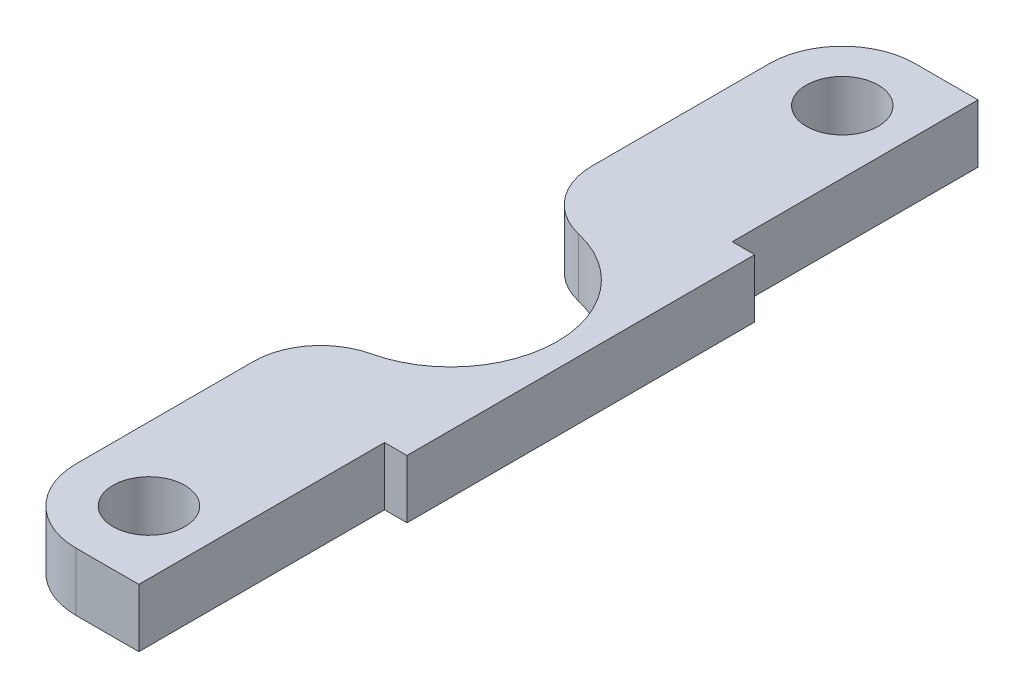
ISO-10303-21;
HEADER;
FILE_DESCRIPTION(('STEP AP214'),'2;1');
FILE_NAME('part.step','',(''),(''),'','','');
FILE_SCHEMA(('AUTOMOTIVE_DESIGN { 1 0 10303 214 1 1 1 1 }'));
ENDSEC;
DATA;
#1=APPLICATION_CONTEXT('core data for automotive mechanical design processes');
#2=APPLICATION_PROTOCOL_DEFINITION('international standard','automotive_design',2000,#1);
#3=PRODUCT_CONTEXT('',#1,'mechanical');
#4=PRODUCT('Part','Part','',(#3));
#5=PRODUCT_RELATED_PRODUCT_CATEGORY('part','',(#4));
#6=PRODUCT_DEFINITION_FORMATION('','',#4);
#7=PRODUCT_DEFINITION_CONTEXT('part definition',#1,'design');
#8=PRODUCT_DEFINITION('design','',#6,#7);
#9=PRODUCT_DEFINITION_SHAPE('','',#8);
#10=(LENGTH_UNIT() NAMED_UNIT(*) SI_UNIT(.MILLI.,.METRE.));
#11=(NAMED_UNIT(*) PLANE_ANGLE_UNIT() SI_UNIT($,.RADIAN.));
#12=(NAMED_UNIT(*) SI_UNIT($,.STERADIAN.) SOLID_ANGLE_UNIT());
#13=UNCERTAINTY_MEASURE_WITH_UNIT(LENGTH_MEASURE(1.E-05),#10,'distance_accuracy_value','');
#14=(GEOMETRIC_REPRESENTATION_CONTEXT(3) GLOBAL_UNCERTAINTY_ASSIGNED_CONTEXT((#13)) GLOBAL_UNIT_ASSIGNED_CONTEXT((#10,
#11,#12)) REPRESENTATION_CONTEXT('',''));
#15=CARTESIAN_POINT('',(0.,0.,0.));
#16=DIRECTION('',(0.,0.,1.));
#17=DIRECTION('',(1.,0.,0.));
#18=AXIS2_PLACEMENT_3D('',#15,#16,#17);
#19=CARTESIAN_POINT('',(-3.25,2.6,-30.9));
#20=DIRECTION('',(1.,0.,0.));
#21=DIRECTION('',(0.,0.,-1.));
#22=AXIS2_PLACEMENT_3D('',#19,#20,#21);
#23=PLANE('',#22);
#24=DIRECTION('',(0.,0.,1.));
#25=VECTOR('',#24,1.);
#26=CARTESIAN_POINT('',(-3.25,2.6,-30.9));
#27=LINE('',#26,#25);
#28=CARTESIAN_POINT('',(-3.25,2.6,-7.90016556472925));
#29=VERTEX_POINT('',#28);
#30=CARTESIAN_POINT('',(-3.25,2.6,0.));
#31=VERTEX_POINT('',#30);
#32=EDGE_CURVE('E186',#29,#31,#27,.T.);
#33=ORIENTED_EDGE('',*,*,#32,.F.);
#34=DIRECTION('',(0.,1.,0.));
#35=VECTOR('',#34,1.);
#36=CARTESIAN_POINT('',(-3.25,2.6,-7.90016556472925));
#37=LINE('',#36,#35);
#38=CARTESIAN_POINT('',(-3.25,0.,-7.90016556472925));
#39=VERTEX_POINT('',#38);
#40=EDGE_CURVE('E172',#29,#39,#37,.F.);
#41=ORIENTED_EDGE('',*,*,#40,.T.);
#42=DIRECTION('',(0.,0.,1.));
#43=VECTOR('',#42,1.);
#44=CARTESIAN_POINT('',(-3.25,0.,-30.9));
#45=LINE('',#44,#43);
#46=CARTESIAN_POINT('',(-3.25,0.,0.));
#47=VERTEX_POINT('',#46);
#48=EDGE_CURVE('E206',#39,#47,#45,.T.);
#49=ORIENTED_EDGE('',*,*,#48,.T.);
#50=DIRECTION('',(0.,-1.,0.));
#51=VECTOR('',#50,1.);
#52=CARTESIAN_POINT('',(-3.25,2.6,0.));
#53=LINE('',#52,#51);
#54=EDGE_CURVE('E194',#31,#47,#53,.T.);
#55=ORIENTED_EDGE('',*,*,#54,.F.);
#56=EDGE_LOOP('',(#33,#41,#49,#55));
#57=FACE_BOUND('',#56,.T.);
#58=ADVANCED_FACE('F32',(#57),#23,.F.);
#59=CARTESIAN_POINT('',(2.8,2.6,-34.15));
#60=DIRECTION('',(-1.,0.,0.));
#61=DIRECTION('',(0.,0.,1.));
#62=AXIS2_PLACEMENT_3D('',#59,#60,#61);
#63=PLANE('',#62);
#64=DIRECTION('',(0.,1.,0.));
#65=VECTOR('',#64,1.);
#66=CARTESIAN_POINT('',(2.8,-15.5322245670091,-23.2));
#67=LINE('',#66,#65);
#68=CARTESIAN_POINT('',(2.8,0.,-23.2));
#69=VERTEX_POINT('',#68);
#70=CARTESIAN_POINT('',(2.8,2.6,-23.2));
#71=VERTEX_POINT('',#70);
#72=EDGE_CURVE('E264',#69,#71,#67,.T.);
#73=ORIENTED_EDGE('',*,*,#72,.F.);
#74=DIRECTION('',(0.,0.,-1.));
#75=VECTOR('',#74,1.);
#76=CARTESIAN_POINT('',(2.8,0.,-34.15));
#77=LINE('',#76,#75);
#78=CARTESIAN_POINT('',(2.8,0.,-34.15));
#79=VERTEX_POINT('',#78);
#80=EDGE_CURVE('E226',#69,#79,#77,.T.);
#81=ORIENTED_EDGE('',*,*,#80,.T.);
#82=DIRECTION('',(0.,-1.,0.));
#83=VECTOR('',#82,1.);
#84=CARTESIAN_POINT('',(2.8,2.6,-34.15));
#85=LINE('',#84,#83);
#86=CARTESIAN_POINT('',(2.8,2.6,-34.15));
#87=VERTEX_POINT('',#86);
#88=EDGE_CURVE('E245',#87,#79,#85,.T.);
#89=ORIENTED_EDGE('',*,*,#88,.F.);
#90=DIRECTION('',(0.,0.,-1.));
#91=VECTOR('',#90,1.);
#92=CARTESIAN_POINT('',(2.8,2.6,-34.15));
#93=LINE('',#92,#91);
#94=EDGE_CURVE('E255',#71,#87,#93,.T.);
#95=ORIENTED_EDGE('',*,*,#94,.F.);
#96=EDGE_LOOP('',(#73,#81,#89,#95));
#97=FACE_BOUND('',#96,.T.);
#98=ADVANCED_FACE('F304',(#97),#63,.F.);
#99=CARTESIAN_POINT('',(0.,2.6,-30.9));
#100=DIRECTION('',(0.,1.,0.));
#101=DIRECTION('',(0.,0.,1.));
#102=AXIS2_PLACEMENT_3D('',#99,#100,#101);
#103=PLANE('',#102);
#104=CARTESIAN_POINT('',(-2.,2.6,-15.45));
#105=DIRECTION('',(0.,1.,0.));
#106=DIRECTION('',(0.,0.,1.));
#107=AXIS2_PLACEMENT_3D('',#104,#105,#106);
#108=CIRCLE('',#107,4.75);
#109=CARTESIAN_POINT('',(-0.927419354838709,2.6,-10.8226821203179));
#110=VERTEX_POINT('',#109);
#111=CARTESIAN_POINT('',(-0.927419354838708,2.6,-20.0773178796821));
#112=VERTEX_POINT('',#111);
#113=EDGE_CURVE('E160',#110,#112,#108,.T.);
#114=ORIENTED_EDGE('',*,*,#113,.F.);
#115=CARTESIAN_POINT('',(-0.249999999999999,2.6,-7.90016556472925));
#116=DIRECTION('',(0.,1.,0.));
#117=DIRECTION('',(0.,0.,1.));
#118=AXIS2_PLACEMENT_3D('',#115,#116,#117);
#119=CIRCLE('',#118,3.);
#120=EDGE_CURVE('E40',#110,#29,#119,.T.);
#121=ORIENTED_EDGE('',*,*,#120,.T.);
#122=ORIENTED_EDGE('',*,*,#32,.T.);
#123=CARTESIAN_POINT('',(0.,2.6,0.));
#124=DIRECTION('',(0.,1.,0.));
#125=DIRECTION('',(0.,0.,1.));
#126=AXIS2_PLACEMENT_3D('',#123,#124,#125);
#127=CIRCLE('',#126,3.25);
#128=CARTESIAN_POINT('',(0.,2.6,3.25));
#129=VERTEX_POINT('',#128);
#130=EDGE_CURVE('E287',#31,#129,#127,.T.);
#131=ORIENTED_EDGE('',*,*,#130,.T.);
#132=DIRECTION('',(1.,0.,0.));
#133=VECTOR('',#132,1.);
#134=CARTESIAN_POINT('',(0.,2.6,3.25));
#135=LINE('',#134,#133);
#136=CARTESIAN_POINT('',(2.8,2.6,3.25));
#137=VERTEX_POINT('',#136);
#138=EDGE_CURVE('E259',#129,#137,#135,.T.);
#139=ORIENTED_EDGE('',*,*,#138,.T.);
#140=CARTESIAN_POINT('',(2.8,2.6,-7.7));
#141=VERTEX_POINT('',#140);
#142=EDGE_CURVE('E159',#137,#141,#93,.T.);
#143=ORIENTED_EDGE('',*,*,#142,.T.);
#144=DIRECTION('',(1.,0.,0.));
#145=VECTOR('',#144,1.);
#146=CARTESIAN_POINT('',(2.80000000000001,2.6,-7.7));
#147=LINE('',#146,#145);
#148=CARTESIAN_POINT('',(3.80000000000001,2.6,-7.7));
#149=VERTEX_POINT('',#148);
#150=EDGE_CURVE('E139',#141,#149,#147,.T.);
#151=ORIENTED_EDGE('',*,*,#150,.T.);
#152=DIRECTION('',(0.,0.,-1.));
#153=VECTOR('',#152,1.);
#154=CARTESIAN_POINT('',(3.8,2.6,-23.2));
#155=LINE('',#154,#153);
#156=CARTESIAN_POINT('',(3.8,2.6,-23.2));
#157=VERTEX_POINT('',#156);
#158=EDGE_CURVE('E148',#149,#157,#155,.T.);
#159=ORIENTED_EDGE('',*,*,#158,.T.);
#160=DIRECTION('',(-1.,0.,0.));
#161=VECTOR('',#160,1.);
#162=CARTESIAN_POINT('',(2.8,2.6,-23.2));
#163=LINE('',#162,#161);
#164=EDGE_CURVE('E153',#157,#71,#163,.T.);
#165=ORIENTED_EDGE('',*,*,#164,.T.);
#166=ORIENTED_EDGE('',*,*,#94,.T.);
#167=DIRECTION('',(-1.,0.,0.));
#168=VECTOR('',#167,1.);
#169=CARTESIAN_POINT('',(0.,2.6,-34.15));
#170=LINE('',#169,#168);
#171=CARTESIAN_POINT('',(0.,2.6,-34.15));
#172=VERTEX_POINT('',#171);
#173=EDGE_CURVE('E249',#87,#172,#170,.T.);
#174=ORIENTED_EDGE('',*,*,#173,.T.);
#175=CARTESIAN_POINT('',(0.,2.6,-30.9));
#176=DIRECTION('',(0.,1.,0.));
#177=DIRECTION('',(0.,0.,1.));
#178=AXIS2_PLACEMENT_3D('',#175,#176,#177);
#179=CIRCLE('',#178,3.25);
#180=CARTESIAN_POINT('',(-3.25,2.6,-30.9));
#181=VERTEX_POINT('',#180);
#182=EDGE_CURVE('E197',#172,#181,#179,.T.);
#183=ORIENTED_EDGE('',*,*,#182,.T.);
#184=CARTESIAN_POINT('',(-3.25,2.6,-22.9998344352707));
#185=VERTEX_POINT('',#184);
#186=EDGE_CURVE('E196',#181,#185,#27,.T.);
#187=ORIENTED_EDGE('',*,*,#186,.T.);
#188=CARTESIAN_POINT('',(-0.25,2.6,-22.9998344352707));
#189=DIRECTION('',(0.,1.,0.));
#190=DIRECTION('',(0.,0.,1.));
#191=AXIS2_PLACEMENT_3D('',#188,#189,#190);
#192=CIRCLE('',#191,3.);
#193=EDGE_CURVE('E47',#185,#112,#192,.T.);
#194=ORIENTED_EDGE('',*,*,#193,.T.);
#195=EDGE_LOOP('',(#114,#121,#122,#131,#139,#143,#151,#159,#165,#166,#174,#183,#187,#194));
#196=FACE_BOUND('',#195,.T.);
#197=CARTESIAN_POINT('',(0.,2.6,0.));
#198=DIRECTION('',(0.,1.,0.));
#199=DIRECTION('',(0.,0.,1.));
#200=AXIS2_PLACEMENT_3D('',#197,#198,#199);
#201=CIRCLE('',#200,1.6);
#202=CARTESIAN_POINT('',(0.,2.6,1.6));
#203=VERTEX_POINT('',#202);
#204=EDGE_CURVE('E282',#203,#203,#201,.T.);
#205=ORIENTED_EDGE('',*,*,#204,.F.);
#206=EDGE_LOOP('',(#205));
#207=FACE_BOUND('',#206,.T.);
#208=CARTESIAN_POINT('',(0.,2.6,-30.9));
#209=DIRECTION('',(0.,1.,0.));
#210=DIRECTION('',(0.,0.,1.));
#211=AXIS2_PLACEMENT_3D('',#208,#209,#210);
#212=CIRCLE('',#211,1.6);
#213=CARTESIAN_POINT('',(0.,2.6,-29.3));
#214=VERTEX_POINT('',#213);
#215=EDGE_CURVE('E275',#214,#214,#212,.T.);
#216=ORIENTED_EDGE('',*,*,#215,.F.);
#217=EDGE_LOOP('',(#216));
#218=FACE_BOUND('',#217,.T.);
#219=ADVANCED_FACE('F156',(#196,#207,#218),#103,.T.);
#220=CARTESIAN_POINT('',(0.,0.,-30.9));
#221=DIRECTION('',(0.,1.,0.));
#222=DIRECTION('',(0.,0.,1.));
#223=AXIS2_PLACEMENT_3D('',#220,#221,#222);
#224=PLANE('',#223);
#225=CARTESIAN_POINT('',(0.,0.,0.));
#226=DIRECTION('',(0.,1.,0.));
#227=DIRECTION('',(0.,0.,1.));
#228=AXIS2_PLACEMENT_3D('',#225,#226,#227);
#229=CIRCLE('',#228,1.6);
#230=CARTESIAN_POINT('',(0.,0.,1.6));
#231=VERTEX_POINT('',#230);
#232=EDGE_CURVE('E278',#231,#231,#229,.T.);
#233=ORIENTED_EDGE('',*,*,#232,.T.);
#234=EDGE_LOOP('',(#233));
#235=FACE_BOUND('',#234,.T.);
#236=ORIENTED_EDGE('',*,*,#48,.F.);
#237=CARTESIAN_POINT('',(-0.249999999999999,0.,-7.90016556472925));
#238=DIRECTION('',(0.,1.,0.));
#239=DIRECTION('',(0.,0.,1.));
#240=AXIS2_PLACEMENT_3D('',#237,#238,#239);
#241=CIRCLE('',#240,3.);
#242=CARTESIAN_POINT('',(-0.927419354838709,0.,-10.8226821203179));
#243=VERTEX_POINT('',#242);
#244=EDGE_CURVE('E178',#39,#243,#241,.F.);
#245=ORIENTED_EDGE('',*,*,#244,.T.);
#246=CARTESIAN_POINT('',(-2.,0.,-15.45));
#247=DIRECTION('',(0.,1.,0.));
#248=DIRECTION('',(0.,0.,1.));
#249=AXIS2_PLACEMENT_3D('',#246,#247,#248);
#250=CIRCLE('',#249,4.75);
#251=CARTESIAN_POINT('',(-0.927419354838708,0.,-20.0773178796821));
#252=VERTEX_POINT('',#251);
#253=EDGE_CURVE('E169',#243,#252,#250,.T.);
#254=ORIENTED_EDGE('',*,*,#253,.T.);
#255=CARTESIAN_POINT('',(-0.25,0.,-22.9998344352707));
#256=DIRECTION('',(0.,1.,0.));
#257=DIRECTION('',(0.,0.,1.));
#258=AXIS2_PLACEMENT_3D('',#255,#256,#257);
#259=CIRCLE('',#258,3.);
#260=CARTESIAN_POINT('',(-3.25,0.,-22.9998344352707));
#261=VERTEX_POINT('',#260);
#262=EDGE_CURVE('E176',#252,#261,#259,.F.);
#263=ORIENTED_EDGE('',*,*,#262,.T.);
#264=CARTESIAN_POINT('',(-3.25,0.,-30.9));
#265=VERTEX_POINT('',#264);
#266=EDGE_CURVE('E211',#265,#261,#45,.T.);
#267=ORIENTED_EDGE('',*,*,#266,.F.);
#268=CARTESIAN_POINT('',(0.,0.,-30.9));
#269=DIRECTION('',(0.,1.,0.));
#270=DIRECTION('',(0.,0.,1.));
#271=AXIS2_PLACEMENT_3D('',#268,#269,#270);
#272=CIRCLE('',#271,3.25);
#273=CARTESIAN_POINT('',(0.,0.,-34.15));
#274=VERTEX_POINT('',#273);
#275=EDGE_CURVE('E221',#274,#265,#272,.T.);
#276=ORIENTED_EDGE('',*,*,#275,.F.);
#277=DIRECTION('',(-1.,0.,0.));
#278=VECTOR('',#277,1.);
#279=CARTESIAN_POINT('',(0.,0.,-34.15));
#280=LINE('',#279,#278);
#281=EDGE_CURVE('E229',#79,#274,#280,.T.);
#282=ORIENTED_EDGE('',*,*,#281,.F.);
#283=ORIENTED_EDGE('',*,*,#80,.F.);
#284=DIRECTION('',(1.,0.,0.));
#285=VECTOR('',#284,1.);
#286=CARTESIAN_POINT('',(2.8,0.,-23.2));
#287=LINE('',#286,#285);
#288=CARTESIAN_POINT('',(3.8,0.,-23.2));
#289=VERTEX_POINT('',#288);
#290=EDGE_CURVE('E301',#69,#289,#287,.T.);
#291=ORIENTED_EDGE('',*,*,#290,.T.);
#292=DIRECTION('',(0.,0.,1.));
#293=VECTOR('',#292,1.);
#294=CARTESIAN_POINT('',(3.8,0.,-23.2));
#295=LINE('',#294,#293);
#296=CARTESIAN_POINT('',(3.80000000000001,0.,-7.7));
#297=VERTEX_POINT('',#296);
#298=EDGE_CURVE('E268',#289,#297,#295,.T.);
#299=ORIENTED_EDGE('',*,*,#298,.T.);
#300=DIRECTION('',(-1.,0.,0.));
#301=VECTOR('',#300,1.);
#302=CARTESIAN_POINT('',(2.80000000000001,0.,-7.7));
#303=LINE('',#302,#301);
#304=CARTESIAN_POINT('',(2.8,0.,-7.7));
#305=VERTEX_POINT('',#304);
#306=EDGE_CURVE('E141',#297,#305,#303,.T.);
#307=ORIENTED_EDGE('',*,*,#306,.T.);
#308=CARTESIAN_POINT('',(2.8,0.,3.25));
#309=VERTEX_POINT('',#308);
#310=EDGE_CURVE('E235',#309,#305,#77,.T.);
#311=ORIENTED_EDGE('',*,*,#310,.F.);
#312=DIRECTION('',(1.,0.,0.));
#313=VECTOR('',#312,1.);
#314=CARTESIAN_POINT('',(0.,0.,3.25));
#315=LINE('',#314,#313);
#316=CARTESIAN_POINT('',(0.,0.,3.25));
#317=VERTEX_POINT('',#316);
#318=EDGE_CURVE('E219',#317,#309,#315,.T.);
#319=ORIENTED_EDGE('',*,*,#318,.F.);
#320=CARTESIAN_POINT('',(0.,0.,0.));
#321=DIRECTION('',(0.,1.,0.));
#322=DIRECTION('',(0.,0.,1.));
#323=AXIS2_PLACEMENT_3D('',#320,#321,#322);
#324=CIRCLE('',#323,3.25);
#325=EDGE_CURVE('E217',#47,#317,#324,.T.);
#326=ORIENTED_EDGE('',*,*,#325,.F.);
#327=EDGE_LOOP('',(#236,#245,#254,#263,#267,#276,#282,#283,#291,#299,#307,#311,#319,#326));
#328=FACE_BOUND('',#327,.T.);
#329=CARTESIAN_POINT('',(0.,0.,-30.9));
#330=DIRECTION('',(0.,1.,0.));
#331=DIRECTION('',(0.,0.,1.));
#332=AXIS2_PLACEMENT_3D('',#329,#330,#331);
#333=CIRCLE('',#332,1.6);
#334=CARTESIAN_POINT('',(0.,0.,-29.3));
#335=VERTEX_POINT('',#334);
#336=EDGE_CURVE('E279',#335,#335,#333,.T.);
#337=ORIENTED_EDGE('',*,*,#336,.T.);
#338=EDGE_LOOP('',(#337));
#339=FACE_BOUND('',#338,.T.);
#340=ADVANCED_FACE('F202',(#235,#328,#339),#224,.F.);
#341=CARTESIAN_POINT('',(0.,2.6,-30.9));
#342=DIRECTION('',(0.,-1.,0.));
#343=DIRECTION('',(0.,0.,-1.));
#344=AXIS2_PLACEMENT_3D('',#341,#342,#343);
#345=CYLINDRICAL_SURFACE('',#344,3.25);
#346=ORIENTED_EDGE('',*,*,#275,.T.);
#347=DIRECTION('',(0.,-1.,0.));
#348=VECTOR('',#347,1.);
#349=CARTESIAN_POINT('',(-3.25,2.6,-30.9));
#350=LINE('',#349,#348);
#351=EDGE_CURVE('E173',#181,#265,#350,.T.);
#352=ORIENTED_EDGE('',*,*,#351,.F.);
#353=ORIENTED_EDGE('',*,*,#182,.F.);
#354=DIRECTION('',(0.,-1.,0.));
#355=VECTOR('',#354,1.);
#356=CARTESIAN_POINT('',(0.,2.6,-34.15));
#357=LINE('',#356,#355);
#358=EDGE_CURVE('E247',#172,#274,#357,.T.);
#359=ORIENTED_EDGE('',*,*,#358,.T.);
#360=EDGE_LOOP('',(#346,#352,#353,#359));
#361=FACE_BOUND('',#360,.T.);
#362=ADVANCED_FACE('F308',(#361),#345,.T.);
#363=ORIENTED_EDGE('',*,*,#266,.T.);
#364=DIRECTION('',(0.,1.,0.));
#365=VECTOR('',#364,1.);
#366=CARTESIAN_POINT('',(-3.25,2.6,-22.9998344352707));
#367=LINE('',#366,#365);
#368=EDGE_CURVE('E11',#261,#185,#367,.T.);
#369=ORIENTED_EDGE('',*,*,#368,.T.);
#370=ORIENTED_EDGE('',*,*,#186,.F.);
#371=ORIENTED_EDGE('',*,*,#351,.T.);
#372=EDGE_LOOP('',(#363,#369,#370,#371));
#373=FACE_BOUND('',#372,.T.);
#374=ADVANCED_FACE('F214',(#373),#23,.F.);
#375=CARTESIAN_POINT('',(0.,2.6,0.));
#376=DIRECTION('',(0.,-1.,0.));
#377=DIRECTION('',(0.,0.,-1.));
#378=AXIS2_PLACEMENT_3D('',#375,#376,#377);
#379=CYLINDRICAL_SURFACE('',#378,3.25);
#380=ORIENTED_EDGE('',*,*,#325,.T.);
#381=DIRECTION('',(0.,-1.,0.));
#382=VECTOR('',#381,1.);
#383=CARTESIAN_POINT('',(0.,2.6,3.25));
#384=LINE('',#383,#382);
#385=EDGE_CURVE('E239',#129,#317,#384,.T.);
#386=ORIENTED_EDGE('',*,*,#385,.F.);
#387=ORIENTED_EDGE('',*,*,#130,.F.);
#388=ORIENTED_EDGE('',*,*,#54,.T.);
#389=EDGE_LOOP('',(#380,#386,#387,#388));
#390=FACE_BOUND('',#389,.T.);
#391=ADVANCED_FACE('F315',(#390),#379,.T.);
#392=CARTESIAN_POINT('',(0.,2.6,3.25));
#393=DIRECTION('',(0.,0.,-1.));
#394=DIRECTION('',(-1.,0.,0.));
#395=AXIS2_PLACEMENT_3D('',#392,#393,#394);
#396=PLANE('',#395);
#397=ORIENTED_EDGE('',*,*,#318,.T.);
#398=DIRECTION('',(0.,-1.,0.));
#399=VECTOR('',#398,1.);
#400=CARTESIAN_POINT('',(2.8,2.6,3.25));
#401=LINE('',#400,#399);
#402=EDGE_CURVE('E242',#137,#309,#401,.T.);
#403=ORIENTED_EDGE('',*,*,#402,.F.);
#404=ORIENTED_EDGE('',*,*,#138,.F.);
#405=ORIENTED_EDGE('',*,*,#385,.T.);
#406=EDGE_LOOP('',(#397,#403,#404,#405));
#407=FACE_BOUND('',#406,.T.);
#408=ADVANCED_FACE('F292',(#407),#396,.F.);
#409=ORIENTED_EDGE('',*,*,#310,.T.);
#410=DIRECTION('',(0.,1.,0.));
#411=VECTOR('',#410,1.);
#412=CARTESIAN_POINT('',(2.80000000000001,-15.5322245670091,-7.7));
#413=LINE('',#412,#411);
#414=EDGE_CURVE('E145',#305,#141,#413,.T.);
#415=ORIENTED_EDGE('',*,*,#414,.T.);
#416=ORIENTED_EDGE('',*,*,#142,.F.);
#417=ORIENTED_EDGE('',*,*,#402,.T.);
#418=EDGE_LOOP('',(#409,#415,#416,#417));
#419=FACE_BOUND('',#418,.T.);
#420=ADVANCED_FACE('F296',(#419),#63,.F.);
#421=CARTESIAN_POINT('',(0.,2.6,-34.15));
#422=DIRECTION('',(0.,0.,1.));
#423=DIRECTION('',(1.,0.,0.));
#424=AXIS2_PLACEMENT_3D('',#421,#422,#423);
#425=PLANE('',#424);
#426=ORIENTED_EDGE('',*,*,#281,.T.);
#427=ORIENTED_EDGE('',*,*,#358,.F.);
#428=ORIENTED_EDGE('',*,*,#173,.F.);
#429=ORIENTED_EDGE('',*,*,#88,.T.);
#430=EDGE_LOOP('',(#426,#427,#428,#429));
#431=FACE_BOUND('',#430,.T.);
#432=ADVANCED_FACE('F307',(#431),#425,.F.);
#433=CARTESIAN_POINT('',(0.,2.6,0.));
#434=DIRECTION('',(0.,-1.,0.));
#435=DIRECTION('',(0.,0.,-1.));
#436=AXIS2_PLACEMENT_3D('',#433,#434,#435);
#437=CYLINDRICAL_SURFACE('',#436,1.6);
#438=ORIENTED_EDGE('',*,*,#204,.T.);
#439=EDGE_LOOP('',(#438));
#440=FACE_BOUND('',#439,.T.);
#441=ORIENTED_EDGE('',*,*,#232,.F.);
#442=EDGE_LOOP('',(#441));
#443=FACE_BOUND('',#442,.T.);
#444=ADVANCED_FACE('F332',(#440,#443),#437,.F.);
#445=CARTESIAN_POINT('',(0.,2.6,-30.9));
#446=DIRECTION('',(0.,-1.,0.));
#447=DIRECTION('',(0.,0.,-1.));
#448=AXIS2_PLACEMENT_3D('',#445,#446,#447);
#449=CYLINDRICAL_SURFACE('',#448,1.6);
#450=ORIENTED_EDGE('',*,*,#215,.T.);
#451=EDGE_LOOP('',(#450));
#452=FACE_BOUND('',#451,.T.);
#453=ORIENTED_EDGE('',*,*,#336,.F.);
#454=EDGE_LOOP('',(#453));
#455=FACE_BOUND('',#454,.T.);
#456=ADVANCED_FACE('F338',(#452,#455),#449,.F.);
#457=CARTESIAN_POINT('',(2.8,-15.5322245670091,-23.2));
#458=DIRECTION('',(0.,0.,-1.));
#459=DIRECTION('',(-1.,0.,0.));
#460=AXIS2_PLACEMENT_3D('',#457,#458,#459);
#461=PLANE('',#460);
#462=ORIENTED_EDGE('',*,*,#290,.F.);
#463=ORIENTED_EDGE('',*,*,#72,.T.);
#464=ORIENTED_EDGE('',*,*,#164,.F.);
#465=DIRECTION('',(0.,1.,0.));
#466=VECTOR('',#465,1.);
#467=CARTESIAN_POINT('',(3.8,-15.5322245670091,-23.2));
#468=LINE('',#467,#466);
#469=EDGE_CURVE('E144',#289,#157,#468,.T.);
#470=ORIENTED_EDGE('',*,*,#469,.F.);
#471=EDGE_LOOP('',(#462,#463,#464,#470));
#472=FACE_BOUND('',#471,.T.);
#473=ADVANCED_FACE('F300',(#472),#461,.T.);
#474=CARTESIAN_POINT('',(3.8,-15.5322245670091,-23.2));
#475=DIRECTION('',(1.,0.,0.));
#476=DIRECTION('',(0.,0.,-1.));
#477=AXIS2_PLACEMENT_3D('',#474,#475,#476);
#478=PLANE('',#477);
#479=ORIENTED_EDGE('',*,*,#298,.F.);
#480=ORIENTED_EDGE('',*,*,#469,.T.);
#481=ORIENTED_EDGE('',*,*,#158,.F.);
#482=DIRECTION('',(0.,1.,0.));
#483=VECTOR('',#482,1.);
#484=CARTESIAN_POINT('',(3.80000000000001,-15.5322245670091,-7.7));
#485=LINE('',#484,#483);
#486=EDGE_CURVE('E134',#297,#149,#485,.T.);
#487=ORIENTED_EDGE('',*,*,#486,.F.);
#488=EDGE_LOOP('',(#479,#480,#481,#487));
#489=FACE_BOUND('',#488,.T.);
#490=ADVANCED_FACE('F149',(#489),#478,.T.);
#491=CARTESIAN_POINT('',(2.80000000000001,-15.5322245670091,-7.7));
#492=DIRECTION('',(0.,0.,1.));
#493=DIRECTION('',(1.,0.,0.));
#494=AXIS2_PLACEMENT_3D('',#491,#492,#493);
#495=PLANE('',#494);
#496=ORIENTED_EDGE('',*,*,#306,.F.);
#497=ORIENTED_EDGE('',*,*,#486,.T.);
#498=ORIENTED_EDGE('',*,*,#150,.F.);
#499=ORIENTED_EDGE('',*,*,#414,.F.);
#500=EDGE_LOOP('',(#496,#497,#498,#499));
#501=FACE_BOUND('',#500,.T.);
#502=ADVANCED_FACE('F136',(#501),#495,.T.);
#503=CARTESIAN_POINT('',(-2.,-5.00000000001367E-05,-15.45));
#504=DIRECTION('',(0.,1.,0.));
#505=DIRECTION('',(0.,0.,1.));
#506=AXIS2_PLACEMENT_3D('',#503,#504,#505);
#507=CYLINDRICAL_SURFACE('',#506,4.75);
#508=ORIENTED_EDGE('',*,*,#253,.F.);
#509=DIRECTION('',(0.,1.,0.));
#510=VECTOR('',#509,1.);
#511=CARTESIAN_POINT('',(-0.927419354838708,-5.00000000001367E-05,-10.8226821203179));
#512=LINE('',#511,#510);
#513=EDGE_CURVE('E182',#243,#110,#512,.T.);
#514=ORIENTED_EDGE('',*,*,#513,.T.);
#515=ORIENTED_EDGE('',*,*,#113,.T.);
#516=DIRECTION('',(0.,1.,0.));
#517=VECTOR('',#516,1.);
#518=CARTESIAN_POINT('',(-0.927419354838709,-5.00000000001367E-05,-20.0773178796821));
#519=LINE('',#518,#517);
#520=EDGE_CURVE('E180',#112,#252,#519,.F.);
#521=ORIENTED_EDGE('',*,*,#520,.T.);
#522=EDGE_LOOP('',(#508,#514,#515,#521));
#523=FACE_BOUND('',#522,.T.);
#524=ADVANCED_FACE('F208',(#523),#507,.F.);
#525=CARTESIAN_POINT('',(-0.249999999999999,-5.00000000001367E-05,-7.90016556472925));
#526=DIRECTION('',(0.,1.,0.));
#527=DIRECTION('',(0.,0.,1.));
#528=AXIS2_PLACEMENT_3D('',#525,#526,#527);
#529=CYLINDRICAL_SURFACE('',#528,3.);
#530=ORIENTED_EDGE('',*,*,#120,.F.);
#531=ORIENTED_EDGE('',*,*,#513,.F.);
#532=ORIENTED_EDGE('',*,*,#244,.F.);
#533=ORIENTED_EDGE('',*,*,#40,.F.);
#534=EDGE_LOOP('',(#530,#531,#532,#533));
#535=FACE_BOUND('',#534,.T.);
#536=ADVANCED_FACE('F199',(#535),#529,.T.);
#537=CARTESIAN_POINT('',(-0.25,-5.00000000001367E-05,-22.9998344352707));
#538=DIRECTION('',(0.,1.,0.));
#539=DIRECTION('',(0.,0.,1.));
#540=AXIS2_PLACEMENT_3D('',#537,#538,#539);
#541=CYLINDRICAL_SURFACE('',#540,3.);
#542=ORIENTED_EDGE('',*,*,#262,.F.);
#543=ORIENTED_EDGE('',*,*,#520,.F.);
#544=ORIENTED_EDGE('',*,*,#193,.F.);
#545=ORIENTED_EDGE('',*,*,#368,.F.);
#546=EDGE_LOOP('',(#542,#543,#544,#545));
#547=FACE_BOUND('',#546,.T.);
#548=ADVANCED_FACE('F34',(#547),#541,.T.);
#549=CLOSED_SHELL('',(#58,#98,#219,#340,#362,#374,#391,#408,#420,#432,#444,#456,#473,#490,#502,
#524,#536,#548));
#550=MANIFOLD_SOLID_BREP('B2',#549);
#551=ADVANCED_BREP_SHAPE_REPRESENTATION('',(#18,#550),#14);
#552=SHAPE_DEFINITION_REPRESENTATION(#9,#551);
ENDSEC;
END-ISO-10303-21;
